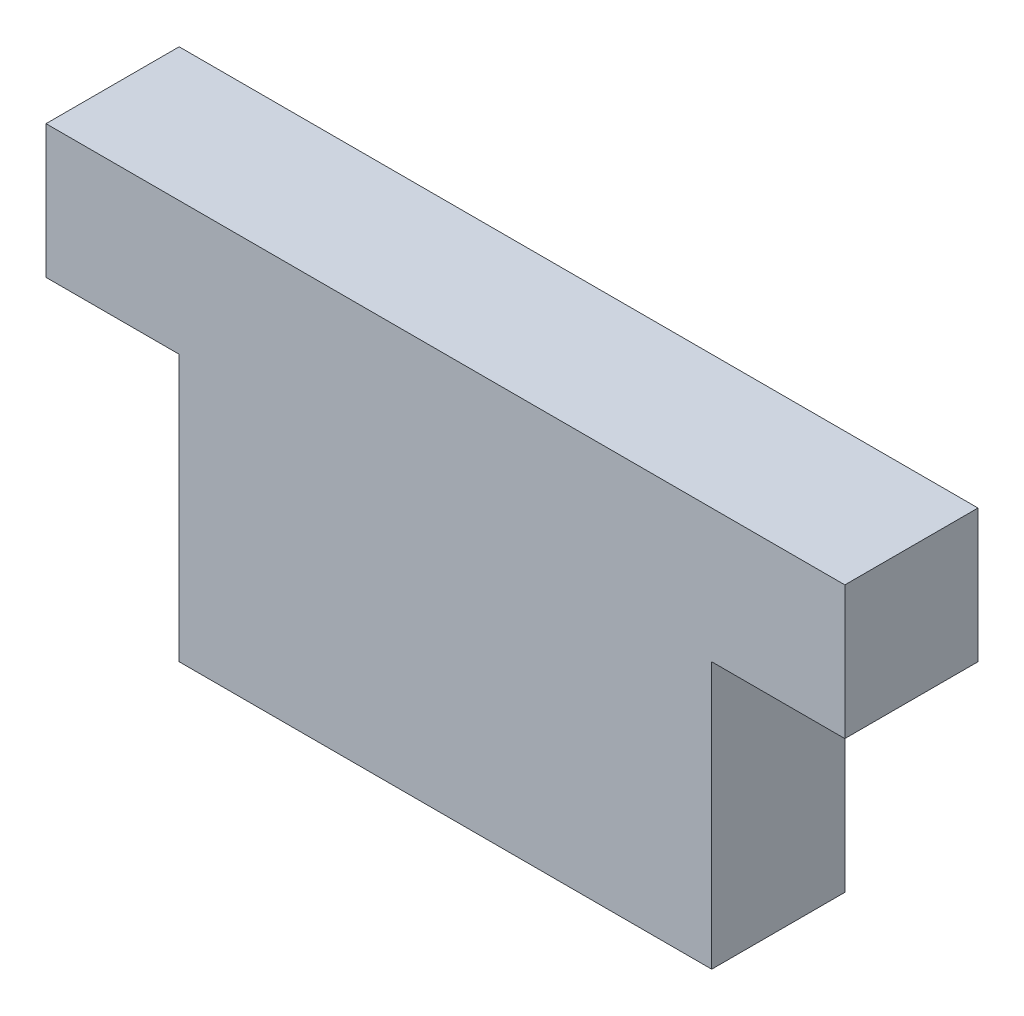
ISO-10303-21;
HEADER;
FILE_DESCRIPTION(('STEP AP214'),'2;1');
FILE_NAME('part.step','',(''),(''),'','','');
FILE_SCHEMA(('AUTOMOTIVE_DESIGN { 1 0 10303 214 1 1 1 1 }'));
ENDSEC;
DATA;
#1=APPLICATION_CONTEXT('core data for automotive mechanical design processes');
#2=APPLICATION_PROTOCOL_DEFINITION('international standard','automotive_design',2000,#1);
#3=PRODUCT_CONTEXT('',#1,'mechanical');
#4=PRODUCT('Part','Part','',(#3));
#5=PRODUCT_RELATED_PRODUCT_CATEGORY('part','',(#4));
#6=PRODUCT_DEFINITION_FORMATION('','',#4);
#7=PRODUCT_DEFINITION_CONTEXT('part definition',#1,'design');
#8=PRODUCT_DEFINITION('design','',#6,#7);
#9=PRODUCT_DEFINITION_SHAPE('','',#8);
#10=(LENGTH_UNIT() NAMED_UNIT(*) SI_UNIT(.MILLI.,.METRE.));
#11=(NAMED_UNIT(*) PLANE_ANGLE_UNIT() SI_UNIT($,.RADIAN.));
#12=(NAMED_UNIT(*) SI_UNIT($,.STERADIAN.) SOLID_ANGLE_UNIT());
#13=UNCERTAINTY_MEASURE_WITH_UNIT(LENGTH_MEASURE(1.E-05),#10,'distance_accuracy_value','');
#14=(GEOMETRIC_REPRESENTATION_CONTEXT(3) GLOBAL_UNCERTAINTY_ASSIGNED_CONTEXT((#13)) GLOBAL_UNIT_ASSIGNED_CONTEXT((#10,
#11,#12)) REPRESENTATION_CONTEXT('',''));
#15=CARTESIAN_POINT('',(0.,0.,0.));
#16=DIRECTION('',(0.,0.,1.));
#17=DIRECTION('',(1.,0.,0.));
#18=AXIS2_PLACEMENT_3D('',#15,#16,#17);
#19=CARTESIAN_POINT('',(0.,0.,5.));
#20=DIRECTION('',(1.,0.,0.));
#21=DIRECTION('',(0.,0.,-1.));
#22=AXIS2_PLACEMENT_3D('',#19,#20,#21);
#23=PLANE('',#22);
#24=DIRECTION('',(0.,-1.,0.));
#25=VECTOR('',#24,1.);
#26=CARTESIAN_POINT('',(0.,0.,0.));
#27=LINE('',#26,#25);
#28=CARTESIAN_POINT('',(0.,0.,0.));
#29=VERTEX_POINT('',#28);
#30=CARTESIAN_POINT('',(0.,-10.,0.));
#31=VERTEX_POINT('',#30);
#32=EDGE_CURVE('E182',#29,#31,#27,.T.);
#33=ORIENTED_EDGE('',*,*,#32,.F.);
#34=DIRECTION('',(0.,0.,-1.));
#35=VECTOR('',#34,1.);
#36=CARTESIAN_POINT('',(0.,0.,5.));
#37=LINE('',#36,#35);
#38=CARTESIAN_POINT('',(0.,0.,5.));
#39=VERTEX_POINT('',#38);
#40=EDGE_CURVE('E12',#39,#29,#37,.T.);
#41=ORIENTED_EDGE('',*,*,#40,.F.);
#42=DIRECTION('',(0.,-1.,0.));
#43=VECTOR('',#42,1.);
#44=CARTESIAN_POINT('',(0.,0.,5.));
#45=LINE('',#44,#43);
#46=CARTESIAN_POINT('',(0.,-10.,5.));
#47=VERTEX_POINT('',#46);
#48=EDGE_CURVE('E140',#39,#47,#45,.T.);
#49=ORIENTED_EDGE('',*,*,#48,.T.);
#50=DIRECTION('',(0.,0.,-1.));
#51=VECTOR('',#50,1.);
#52=CARTESIAN_POINT('',(0.,-10.,5.));
#53=LINE('',#52,#51);
#54=EDGE_CURVE('E51',#47,#31,#53,.T.);
#55=ORIENTED_EDGE('',*,*,#54,.T.);
#56=EDGE_LOOP('',(#33,#41,#49,#55));
#57=FACE_BOUND('',#56,.T.);
#58=ADVANCED_FACE('F35',(#57),#23,.T.);
#59=CARTESIAN_POINT('',(0.,0.,5.));
#60=DIRECTION('',(0.,1.,0.));
#61=DIRECTION('',(0.,0.,1.));
#62=AXIS2_PLACEMENT_3D('',#59,#60,#61);
#63=PLANE('',#62);
#64=DIRECTION('',(1.,0.,0.));
#65=VECTOR('',#64,1.);
#66=CARTESIAN_POINT('',(0.,0.,0.));
#67=LINE('',#66,#65);
#68=CARTESIAN_POINT('',(5.,0.,0.));
#69=VERTEX_POINT('',#68);
#70=EDGE_CURVE('E181',#29,#69,#67,.T.);
#71=ORIENTED_EDGE('',*,*,#70,.T.);
#72=DIRECTION('',(0.,0.,-1.));
#73=VECTOR('',#72,1.);
#74=CARTESIAN_POINT('',(5.,0.,5.));
#75=LINE('',#74,#73);
#76=CARTESIAN_POINT('',(5.,0.,5.));
#77=VERTEX_POINT('',#76);
#78=EDGE_CURVE('E43',#77,#69,#75,.T.);
#79=ORIENTED_EDGE('',*,*,#78,.F.);
#80=DIRECTION('',(1.,0.,0.));
#81=VECTOR('',#80,1.);
#82=CARTESIAN_POINT('',(0.,0.,5.));
#83=LINE('',#82,#81);
#84=EDGE_CURVE('E114',#39,#77,#83,.T.);
#85=ORIENTED_EDGE('',*,*,#84,.F.);
#86=ORIENTED_EDGE('',*,*,#40,.T.);
#87=EDGE_LOOP('',(#71,#79,#85,#86));
#88=FACE_BOUND('',#87,.T.);
#89=ADVANCED_FACE('F197',(#88),#63,.F.);
#90=CARTESIAN_POINT('',(5.,0.,5.));
#91=DIRECTION('',(-1.,0.,0.));
#92=DIRECTION('',(0.,-1.,0.));
#93=AXIS2_PLACEMENT_3D('',#90,#91,#92);
#94=PLANE('',#93);
#95=DIRECTION('',(0.,1.,0.));
#96=VECTOR('',#95,1.);
#97=CARTESIAN_POINT('',(5.,0.,0.));
#98=LINE('',#97,#96);
#99=CARTESIAN_POINT('',(5.,5.,0.));
#100=VERTEX_POINT('',#99);
#101=EDGE_CURVE('E160',#69,#100,#98,.T.);
#102=ORIENTED_EDGE('',*,*,#101,.T.);
#103=DIRECTION('',(0.,0.,-1.));
#104=VECTOR('',#103,1.);
#105=CARTESIAN_POINT('',(5.,5.,5.));
#106=LINE('',#105,#104);
#107=CARTESIAN_POINT('',(5.,5.,5.));
#108=VERTEX_POINT('',#107);
#109=EDGE_CURVE('E157',#108,#100,#106,.T.);
#110=ORIENTED_EDGE('',*,*,#109,.F.);
#111=DIRECTION('',(0.,1.,0.));
#112=VECTOR('',#111,1.);
#113=CARTESIAN_POINT('',(5.,0.,5.));
#114=LINE('',#113,#112);
#115=EDGE_CURVE('E139',#77,#108,#114,.T.);
#116=ORIENTED_EDGE('',*,*,#115,.F.);
#117=ORIENTED_EDGE('',*,*,#78,.T.);
#118=EDGE_LOOP('',(#102,#110,#116,#117));
#119=FACE_BOUND('',#118,.T.);
#120=ADVANCED_FACE('F158',(#119),#94,.F.);
#121=CARTESIAN_POINT('',(0.,5.,5.));
#122=DIRECTION('',(0.,1.,0.));
#123=DIRECTION('',(0.,0.,1.));
#124=AXIS2_PLACEMENT_3D('',#121,#122,#123);
#125=PLANE('',#124);
#126=DIRECTION('',(1.,0.,0.));
#127=VECTOR('',#126,1.);
#128=CARTESIAN_POINT('',(0.,5.,0.));
#129=LINE('',#128,#127);
#130=CARTESIAN_POINT('',(-25.,5.,0.));
#131=VERTEX_POINT('',#130);
#132=EDGE_CURVE('E178',#131,#100,#129,.T.);
#133=ORIENTED_EDGE('',*,*,#132,.F.);
#134=DIRECTION('',(0.,0.,-1.));
#135=VECTOR('',#134,1.);
#136=CARTESIAN_POINT('',(-25.,5.,5.));
#137=LINE('',#136,#135);
#138=CARTESIAN_POINT('',(-25.,5.,5.));
#139=VERTEX_POINT('',#138);
#140=EDGE_CURVE('E163',#139,#131,#137,.T.);
#141=ORIENTED_EDGE('',*,*,#140,.F.);
#142=DIRECTION('',(1.,0.,0.));
#143=VECTOR('',#142,1.);
#144=CARTESIAN_POINT('',(0.,5.,5.));
#145=LINE('',#144,#143);
#146=EDGE_CURVE('E147',#139,#108,#145,.T.);
#147=ORIENTED_EDGE('',*,*,#146,.T.);
#148=ORIENTED_EDGE('',*,*,#109,.T.);
#149=EDGE_LOOP('',(#133,#141,#147,#148));
#150=FACE_BOUND('',#149,.T.);
#151=ADVANCED_FACE('F206',(#150),#125,.T.);
#152=CARTESIAN_POINT('',(-25.,0.,5.));
#153=DIRECTION('',(-1.,0.,0.));
#154=DIRECTION('',(0.,0.,1.));
#155=AXIS2_PLACEMENT_3D('',#152,#153,#154);
#156=PLANE('',#155);
#157=DIRECTION('',(0.,1.,0.));
#158=VECTOR('',#157,1.);
#159=CARTESIAN_POINT('',(-25.,0.,0.));
#160=LINE('',#159,#158);
#161=CARTESIAN_POINT('',(-25.,0.,0.));
#162=VERTEX_POINT('',#161);
#163=EDGE_CURVE('E175',#162,#131,#160,.T.);
#164=ORIENTED_EDGE('',*,*,#163,.F.);
#165=DIRECTION('',(0.,0.,-1.));
#166=VECTOR('',#165,1.);
#167=CARTESIAN_POINT('',(-25.,0.,5.));
#168=LINE('',#167,#166);
#169=CARTESIAN_POINT('',(-25.,0.,5.));
#170=VERTEX_POINT('',#169);
#171=EDGE_CURVE('E122',#170,#162,#168,.T.);
#172=ORIENTED_EDGE('',*,*,#171,.F.);
#173=DIRECTION('',(0.,1.,0.));
#174=VECTOR('',#173,1.);
#175=CARTESIAN_POINT('',(-25.,0.,5.));
#176=LINE('',#175,#174);
#177=EDGE_CURVE('E111',#170,#139,#176,.T.);
#178=ORIENTED_EDGE('',*,*,#177,.T.);
#179=ORIENTED_EDGE('',*,*,#140,.T.);
#180=EDGE_LOOP('',(#164,#172,#178,#179));
#181=FACE_BOUND('',#180,.T.);
#182=ADVANCED_FACE('F209',(#181),#156,.T.);
#183=CARTESIAN_POINT('',(-20.,0.,0.));
#184=VERTEX_POINT('',#183);
#185=EDGE_CURVE('E119',#162,#184,#67,.T.);
#186=ORIENTED_EDGE('',*,*,#185,.T.);
#187=DIRECTION('',(0.,0.,-1.));
#188=VECTOR('',#187,1.);
#189=CARTESIAN_POINT('',(-20.,0.,5.));
#190=LINE('',#189,#188);
#191=CARTESIAN_POINT('',(-20.,0.,5.));
#192=VERTEX_POINT('',#191);
#193=EDGE_CURVE('E116',#192,#184,#190,.T.);
#194=ORIENTED_EDGE('',*,*,#193,.F.);
#195=EDGE_CURVE('E102',#170,#192,#83,.T.);
#196=ORIENTED_EDGE('',*,*,#195,.F.);
#197=ORIENTED_EDGE('',*,*,#171,.T.);
#198=EDGE_LOOP('',(#186,#194,#196,#197));
#199=FACE_BOUND('',#198,.T.);
#200=ADVANCED_FACE('F117',(#199),#63,.F.);
#201=CARTESIAN_POINT('',(-20.,0.,5.));
#202=DIRECTION('',(1.,0.,0.));
#203=DIRECTION('',(0.,0.,-1.));
#204=AXIS2_PLACEMENT_3D('',#201,#202,#203);
#205=PLANE('',#204);
#206=DIRECTION('',(0.,-1.,0.));
#207=VECTOR('',#206,1.);
#208=CARTESIAN_POINT('',(-20.,0.,0.));
#209=LINE('',#208,#207);
#210=CARTESIAN_POINT('',(-20.,-10.,0.));
#211=VERTEX_POINT('',#210);
#212=EDGE_CURVE('E173',#184,#211,#209,.T.);
#213=ORIENTED_EDGE('',*,*,#212,.T.);
#214=DIRECTION('',(0.,0.,-1.));
#215=VECTOR('',#214,1.);
#216=CARTESIAN_POINT('',(-20.,-10.,5.));
#217=LINE('',#216,#215);
#218=CARTESIAN_POINT('',(-20.,-10.,5.));
#219=VERTEX_POINT('',#218);
#220=EDGE_CURVE('E77',#219,#211,#217,.T.);
#221=ORIENTED_EDGE('',*,*,#220,.F.);
#222=DIRECTION('',(0.,-1.,0.));
#223=VECTOR('',#222,1.);
#224=CARTESIAN_POINT('',(-20.,0.,5.));
#225=LINE('',#224,#223);
#226=EDGE_CURVE('E108',#192,#219,#225,.T.);
#227=ORIENTED_EDGE('',*,*,#226,.F.);
#228=ORIENTED_EDGE('',*,*,#193,.T.);
#229=EDGE_LOOP('',(#213,#221,#227,#228));
#230=FACE_BOUND('',#229,.T.);
#231=ADVANCED_FACE('F124',(#230),#205,.F.);
#232=CARTESIAN_POINT('',(0.,-10.,5.));
#233=DIRECTION('',(0.,-1.,0.));
#234=DIRECTION('',(1.,0.,0.));
#235=AXIS2_PLACEMENT_3D('',#232,#233,#234);
#236=PLANE('',#235);
#237=DIRECTION('',(-1.,0.,0.));
#238=VECTOR('',#237,1.);
#239=CARTESIAN_POINT('',(0.,-10.,0.));
#240=LINE('',#239,#238);
#241=EDGE_CURVE('E170',#31,#211,#240,.T.);
#242=ORIENTED_EDGE('',*,*,#241,.F.);
#243=ORIENTED_EDGE('',*,*,#54,.F.);
#244=DIRECTION('',(-1.,0.,0.));
#245=VECTOR('',#244,1.);
#246=CARTESIAN_POINT('',(0.,-10.,5.));
#247=LINE('',#246,#245);
#248=EDGE_CURVE('E125',#47,#219,#247,.T.);
#249=ORIENTED_EDGE('',*,*,#248,.T.);
#250=ORIENTED_EDGE('',*,*,#220,.T.);
#251=EDGE_LOOP('',(#242,#243,#249,#250));
#252=FACE_BOUND('',#251,.T.);
#253=ADVANCED_FACE('F186',(#252),#236,.T.);
#254=CARTESIAN_POINT('',(0.,0.,5.));
#255=DIRECTION('',(0.,0.,1.));
#256=DIRECTION('',(1.,0.,0.));
#257=AXIS2_PLACEMENT_3D('',#254,#255,#256);
#258=PLANE('',#257);
#259=ORIENTED_EDGE('',*,*,#48,.F.);
#260=ORIENTED_EDGE('',*,*,#84,.T.);
#261=ORIENTED_EDGE('',*,*,#115,.T.);
#262=ORIENTED_EDGE('',*,*,#146,.F.);
#263=ORIENTED_EDGE('',*,*,#177,.F.);
#264=ORIENTED_EDGE('',*,*,#195,.T.);
#265=ORIENTED_EDGE('',*,*,#226,.T.);
#266=ORIENTED_EDGE('',*,*,#248,.F.);
#267=EDGE_LOOP('',(#259,#260,#261,#262,#263,#264,#265,#266));
#268=FACE_BOUND('',#267,.T.);
#269=ADVANCED_FACE('F105',(#268),#258,.T.);
#270=CARTESIAN_POINT('',(0.,0.,0.));
#271=DIRECTION('',(0.,0.,1.));
#272=DIRECTION('',(1.,0.,0.));
#273=AXIS2_PLACEMENT_3D('',#270,#271,#272);
#274=PLANE('',#273);
#275=ORIENTED_EDGE('',*,*,#32,.T.);
#276=ORIENTED_EDGE('',*,*,#241,.T.);
#277=ORIENTED_EDGE('',*,*,#212,.F.);
#278=ORIENTED_EDGE('',*,*,#185,.F.);
#279=ORIENTED_EDGE('',*,*,#163,.T.);
#280=ORIENTED_EDGE('',*,*,#132,.T.);
#281=ORIENTED_EDGE('',*,*,#101,.F.);
#282=ORIENTED_EDGE('',*,*,#70,.F.);
#283=EDGE_LOOP('',(#275,#276,#277,#278,#279,#280,#281,#282));
#284=FACE_BOUND('',#283,.T.);
#285=ADVANCED_FACE('F185',(#284),#274,.F.);
#286=CLOSED_SHELL('',(#58,#89,#120,#151,#182,#200,#231,#253,#269,#285));
#287=MANIFOLD_SOLID_BREP('B2',#286);
#288=ADVANCED_BREP_SHAPE_REPRESENTATION('',(#18,#287),#14);
#289=SHAPE_DEFINITION_REPRESENTATION(#9,#288);
ENDSEC;
END-ISO-10303-21;
